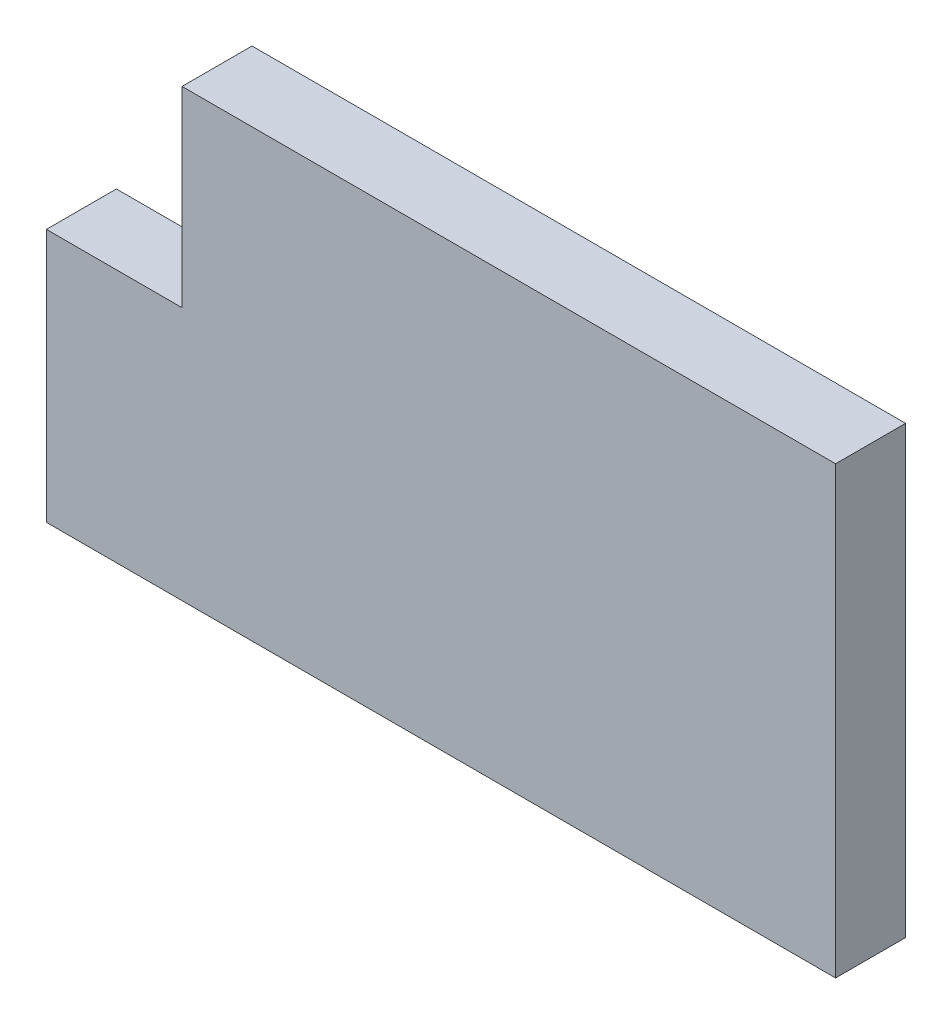
ISO-10303-21;
HEADER;
FILE_DESCRIPTION(('STEP AP214'),'2;1');
FILE_NAME('part.step','',(''),(''),'','','');
FILE_SCHEMA(('AUTOMOTIVE_DESIGN { 1 0 10303 214 1 1 1 1 }'));
ENDSEC;
DATA;
#1=APPLICATION_CONTEXT('core data for automotive mechanical design processes');
#2=APPLICATION_PROTOCOL_DEFINITION('international standard','automotive_design',2000,#1);
#3=PRODUCT_CONTEXT('',#1,'mechanical');
#4=PRODUCT('Part','Part','',(#3));
#5=PRODUCT_RELATED_PRODUCT_CATEGORY('part','',(#4));
#6=PRODUCT_DEFINITION_FORMATION('','',#4);
#7=PRODUCT_DEFINITION_CONTEXT('part definition',#1,'design');
#8=PRODUCT_DEFINITION('design','',#6,#7);
#9=PRODUCT_DEFINITION_SHAPE('','',#8);
#10=(LENGTH_UNIT() NAMED_UNIT(*) SI_UNIT(.MILLI.,.METRE.));
#11=(NAMED_UNIT(*) PLANE_ANGLE_UNIT() SI_UNIT($,.RADIAN.));
#12=(NAMED_UNIT(*) SI_UNIT($,.STERADIAN.) SOLID_ANGLE_UNIT());
#13=UNCERTAINTY_MEASURE_WITH_UNIT(LENGTH_MEASURE(1.E-05),#10,'distance_accuracy_value','');
#14=(GEOMETRIC_REPRESENTATION_CONTEXT(3) GLOBAL_UNCERTAINTY_ASSIGNED_CONTEXT((#13)) GLOBAL_UNIT_ASSIGNED_CONTEXT((#10,
#11,#12)) REPRESENTATION_CONTEXT('',''));
#15=CARTESIAN_POINT('',(0.,0.,0.));
#16=DIRECTION('',(0.,0.,1.));
#17=DIRECTION('',(1.,0.,0.));
#18=AXIS2_PLACEMENT_3D('',#15,#16,#17);
#19=CARTESIAN_POINT('',(606.354027490195,2129.28599467213,800.));
#20=DIRECTION('',(1.,0.,0.));
#21=DIRECTION('',(0.,0.,-1.));
#22=AXIS2_PLACEMENT_3D('',#19,#20,#21);
#23=PLANE('',#22);
#24=DIRECTION('',(0.,-1.,0.));
#25=VECTOR('',#24,1.);
#26=CARTESIAN_POINT('',(606.354027490195,2129.28599467213,0.));
#27=LINE('',#26,#25);
#28=CARTESIAN_POINT('',(606.354027490195,2129.28599467213,0.));
#29=VERTEX_POINT('',#28);
#30=CARTESIAN_POINT('',(606.354027490195,-60.7140053278613,0.));
#31=VERTEX_POINT('',#30);
#32=EDGE_CURVE('E117',#29,#31,#27,.T.);
#33=ORIENTED_EDGE('',*,*,#32,.T.);
#34=DIRECTION('',(0.,0.,-1.));
#35=VECTOR('',#34,1.);
#36=CARTESIAN_POINT('',(606.354027490195,-60.7140053278613,800.));
#37=LINE('',#36,#35);
#38=CARTESIAN_POINT('',(606.354027490195,-60.7140053278613,800.));
#39=VERTEX_POINT('',#38);
#40=EDGE_CURVE('E40',#39,#31,#37,.T.);
#41=ORIENTED_EDGE('',*,*,#40,.F.);
#42=DIRECTION('',(0.,-1.,0.));
#43=VECTOR('',#42,1.);
#44=CARTESIAN_POINT('',(606.354027490195,2129.28599467213,800.));
#45=LINE('',#44,#43);
#46=CARTESIAN_POINT('',(606.354027490195,2129.28599467213,800.));
#47=VERTEX_POINT('',#46);
#48=EDGE_CURVE('E82',#47,#39,#45,.T.);
#49=ORIENTED_EDGE('',*,*,#48,.F.);
#50=DIRECTION('',(0.,0.,-1.));
#51=VECTOR('',#50,1.);
#52=CARTESIAN_POINT('',(606.354027490195,2129.28599467213,800.));
#53=LINE('',#52,#51);
#54=EDGE_CURVE('E11',#47,#29,#53,.T.);
#55=ORIENTED_EDGE('',*,*,#54,.T.);
#56=EDGE_LOOP('',(#33,#41,#49,#55));
#57=FACE_BOUND('',#56,.T.);
#58=ADVANCED_FACE('F32',(#57),#23,.F.);
#59=CARTESIAN_POINT('',(-943.645972509804,-60.7140053278613,800.));
#60=DIRECTION('',(0.,1.,0.));
#61=DIRECTION('',(0.,0.,1.));
#62=AXIS2_PLACEMENT_3D('',#59,#60,#61);
#63=PLANE('',#62);
#64=DIRECTION('',(1.,0.,0.));
#65=VECTOR('',#64,1.);
#66=CARTESIAN_POINT('',(-943.645972509804,-60.7140053278613,0.));
#67=LINE('',#66,#65);
#68=CARTESIAN_POINT('',(-943.645972509804,-60.7140053278613,0.));
#69=VERTEX_POINT('',#68);
#70=EDGE_CURVE('E120',#69,#31,#67,.T.);
#71=ORIENTED_EDGE('',*,*,#70,.F.);
#72=DIRECTION('',(0.,0.,-1.));
#73=VECTOR('',#72,1.);
#74=CARTESIAN_POINT('',(-943.645972509804,-60.7140053278613,800.));
#75=LINE('',#74,#73);
#76=CARTESIAN_POINT('',(-943.645972509804,-60.7140053278613,800.));
#77=VERTEX_POINT('',#76);
#78=EDGE_CURVE('E108',#77,#69,#75,.T.);
#79=ORIENTED_EDGE('',*,*,#78,.F.);
#80=DIRECTION('',(1.,0.,0.));
#81=VECTOR('',#80,1.);
#82=CARTESIAN_POINT('',(-943.645972509804,-60.7140053278613,800.));
#83=LINE('',#82,#81);
#84=EDGE_CURVE('E97',#77,#39,#83,.T.);
#85=ORIENTED_EDGE('',*,*,#84,.T.);
#86=ORIENTED_EDGE('',*,*,#40,.T.);
#87=EDGE_LOOP('',(#71,#79,#85,#86));
#88=FACE_BOUND('',#87,.T.);
#89=ADVANCED_FACE('F133',(#88),#63,.T.);
#90=CARTESIAN_POINT('',(-943.645972509804,-2960.71400532786,800.));
#91=DIRECTION('',(-1.,0.,0.));
#92=DIRECTION('',(0.,0.,1.));
#93=AXIS2_PLACEMENT_3D('',#90,#91,#92);
#94=PLANE('',#93);
#95=DIRECTION('',(0.,1.,0.));
#96=VECTOR('',#95,1.);
#97=CARTESIAN_POINT('',(-943.645972509804,-2960.71400532786,0.));
#98=LINE('',#97,#96);
#99=CARTESIAN_POINT('',(-943.645972509804,-2960.71400532786,0.));
#100=VERTEX_POINT('',#99);
#101=EDGE_CURVE('E105',#100,#69,#98,.T.);
#102=ORIENTED_EDGE('',*,*,#101,.F.);
#103=DIRECTION('',(0.,0.,-1.));
#104=VECTOR('',#103,1.);
#105=CARTESIAN_POINT('',(-943.645972509804,-2960.71400532786,800.));
#106=LINE('',#105,#104);
#107=CARTESIAN_POINT('',(-943.645972509804,-2960.71400532786,800.));
#108=VERTEX_POINT('',#107);
#109=EDGE_CURVE('E103',#108,#100,#106,.T.);
#110=ORIENTED_EDGE('',*,*,#109,.F.);
#111=DIRECTION('',(0.,1.,0.));
#112=VECTOR('',#111,1.);
#113=CARTESIAN_POINT('',(-943.645972509804,-360.714005327861,800.));
#114=LINE('',#113,#112);
#115=EDGE_CURVE('E90',#108,#77,#114,.T.);
#116=ORIENTED_EDGE('',*,*,#115,.T.);
#117=ORIENTED_EDGE('',*,*,#78,.T.);
#118=EDGE_LOOP('',(#102,#110,#116,#117));
#119=FACE_BOUND('',#118,.T.);
#120=ADVANCED_FACE('F104',(#119),#94,.T.);
#121=CARTESIAN_POINT('',(8076.3540274902,-2960.71400532786,800.));
#122=DIRECTION('',(0.,-1.,0.));
#123=DIRECTION('',(1.,0.,0.));
#124=AXIS2_PLACEMENT_3D('',#121,#122,#123);
#125=PLANE('',#124);
#126=DIRECTION('',(-1.,0.,0.));
#127=VECTOR('',#126,1.);
#128=CARTESIAN_POINT('',(8076.3540274902,-2960.71400532786,0.));
#129=LINE('',#128,#127);
#130=CARTESIAN_POINT('',(8076.3540274902,-2960.71400532786,0.));
#131=VERTEX_POINT('',#130);
#132=EDGE_CURVE('E124',#131,#100,#129,.T.);
#133=ORIENTED_EDGE('',*,*,#132,.F.);
#134=DIRECTION('',(0.,0.,-1.));
#135=VECTOR('',#134,1.);
#136=CARTESIAN_POINT('',(8076.3540274902,-2960.71400532786,800.));
#137=LINE('',#136,#135);
#138=CARTESIAN_POINT('',(8076.3540274902,-2960.71400532786,800.));
#139=VERTEX_POINT('',#138);
#140=EDGE_CURVE('E109',#139,#131,#137,.T.);
#141=ORIENTED_EDGE('',*,*,#140,.F.);
#142=DIRECTION('',(-1.,0.,0.));
#143=VECTOR('',#142,1.);
#144=CARTESIAN_POINT('',(-643.645972509803,-2960.71400532786,800.));
#145=LINE('',#144,#143);
#146=EDGE_CURVE('E94',#139,#108,#145,.T.);
#147=ORIENTED_EDGE('',*,*,#146,.T.);
#148=ORIENTED_EDGE('',*,*,#109,.T.);
#149=EDGE_LOOP('',(#133,#141,#147,#148));
#150=FACE_BOUND('',#149,.T.);
#151=ADVANCED_FACE('F111',(#150),#125,.T.);
#152=CARTESIAN_POINT('',(8076.3540274902,2129.28599467213,800.));
#153=DIRECTION('',(1.,0.,0.));
#154=DIRECTION('',(0.,0.,-1.));
#155=AXIS2_PLACEMENT_3D('',#152,#153,#154);
#156=PLANE('',#155);
#157=DIRECTION('',(0.,-1.,0.));
#158=VECTOR('',#157,1.);
#159=CARTESIAN_POINT('',(8076.3540274902,2129.28599467213,0.));
#160=LINE('',#159,#158);
#161=CARTESIAN_POINT('',(8076.3540274902,2129.28599467213,0.));
#162=VERTEX_POINT('',#161);
#163=EDGE_CURVE('E70',#162,#131,#160,.T.);
#164=ORIENTED_EDGE('',*,*,#163,.F.);
#165=DIRECTION('',(0.,0.,-1.));
#166=VECTOR('',#165,1.);
#167=CARTESIAN_POINT('',(8076.3540274902,2129.28599467213,800.));
#168=LINE('',#167,#166);
#169=CARTESIAN_POINT('',(8076.3540274902,2129.28599467213,800.));
#170=VERTEX_POINT('',#169);
#171=EDGE_CURVE('E113',#170,#162,#168,.T.);
#172=ORIENTED_EDGE('',*,*,#171,.F.);
#173=DIRECTION('',(0.,-1.,0.));
#174=VECTOR('',#173,1.);
#175=CARTESIAN_POINT('',(8076.3540274902,-2660.71400532786,800.));
#176=LINE('',#175,#174);
#177=EDGE_CURVE('E48',#170,#139,#176,.T.);
#178=ORIENTED_EDGE('',*,*,#177,.T.);
#179=ORIENTED_EDGE('',*,*,#140,.T.);
#180=EDGE_LOOP('',(#164,#172,#178,#179));
#181=FACE_BOUND('',#180,.T.);
#182=ADVANCED_FACE('F155',(#181),#156,.T.);
#183=CARTESIAN_POINT('',(906.354027490195,2129.28599467213,800.));
#184=DIRECTION('',(0.,1.,0.));
#185=DIRECTION('',(0.,0.,1.));
#186=AXIS2_PLACEMENT_3D('',#183,#184,#185);
#187=PLANE('',#186);
#188=DIRECTION('',(1.,0.,0.));
#189=VECTOR('',#188,1.);
#190=CARTESIAN_POINT('',(906.354027490195,2129.28599467213,0.));
#191=LINE('',#190,#189);
#192=EDGE_CURVE('E74',#29,#162,#191,.T.);
#193=ORIENTED_EDGE('',*,*,#192,.F.);
#194=ORIENTED_EDGE('',*,*,#54,.F.);
#195=DIRECTION('',(-1.,0.,0.));
#196=VECTOR('',#195,1.);
#197=CARTESIAN_POINT('',(906.354027490195,2129.28599467213,800.));
#198=LINE('',#197,#196);
#199=EDGE_CURVE('E128',#170,#47,#198,.T.);
#200=ORIENTED_EDGE('',*,*,#199,.F.);
#201=ORIENTED_EDGE('',*,*,#171,.T.);
#202=EDGE_LOOP('',(#193,#194,#200,#201));
#203=FACE_BOUND('',#202,.T.);
#204=ADVANCED_FACE('F141',(#203),#187,.T.);
#205=CARTESIAN_POINT('',(0.,0.,800.));
#206=DIRECTION('',(0.,0.,1.));
#207=DIRECTION('',(1.,0.,0.));
#208=AXIS2_PLACEMENT_3D('',#205,#206,#207);
#209=PLANE('',#208);
#210=ORIENTED_EDGE('',*,*,#199,.T.);
#211=ORIENTED_EDGE('',*,*,#48,.T.);
#212=ORIENTED_EDGE('',*,*,#84,.F.);
#213=ORIENTED_EDGE('',*,*,#115,.F.);
#214=ORIENTED_EDGE('',*,*,#146,.F.);
#215=ORIENTED_EDGE('',*,*,#177,.F.);
#216=EDGE_LOOP('',(#210,#211,#212,#213,#214,#215));
#217=FACE_BOUND('',#216,.T.);
#218=ADVANCED_FACE('F92',(#217),#209,.T.);
#219=CARTESIAN_POINT('',(0.,0.,0.));
#220=DIRECTION('',(0.,0.,1.));
#221=DIRECTION('',(1.,0.,0.));
#222=AXIS2_PLACEMENT_3D('',#219,#220,#221);
#223=PLANE('',#222);
#224=ORIENTED_EDGE('',*,*,#32,.F.);
#225=ORIENTED_EDGE('',*,*,#192,.T.);
#226=ORIENTED_EDGE('',*,*,#163,.T.);
#227=ORIENTED_EDGE('',*,*,#132,.T.);
#228=ORIENTED_EDGE('',*,*,#101,.T.);
#229=ORIENTED_EDGE('',*,*,#70,.T.);
#230=EDGE_LOOP('',(#224,#225,#226,#227,#228,#229));
#231=FACE_BOUND('',#230,.T.);
#232=ADVANCED_FACE('F135',(#231),#223,.F.);
#233=CLOSED_SHELL('',(#58,#89,#120,#151,#182,#204,#218,#232));
#234=MANIFOLD_SOLID_BREP('B2',#233);
#235=ADVANCED_BREP_SHAPE_REPRESENTATION('',(#18,#234),#14);
#236=SHAPE_DEFINITION_REPRESENTATION(#9,#235);
ENDSEC;
END-ISO-10303-21;
